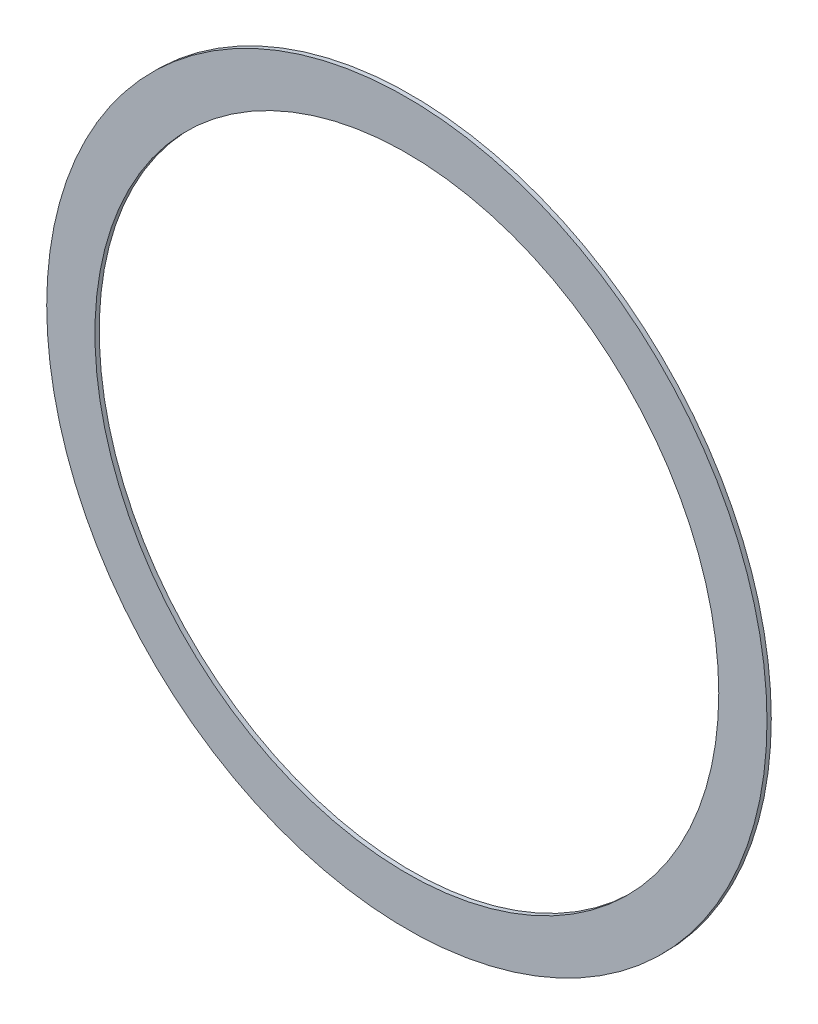
ISO-10303-21;
HEADER;
FILE_DESCRIPTION(('STEP AP214'),'2;1');
FILE_NAME('part.step','',(''),(''),'','','');
FILE_SCHEMA(('AUTOMOTIVE_DESIGN { 1 0 10303 214 1 1 1 1 }'));
ENDSEC;
DATA;
#1=APPLICATION_CONTEXT('core data for automotive mechanical design processes');
#2=APPLICATION_PROTOCOL_DEFINITION('international standard','automotive_design',2000,#1);
#3=PRODUCT_CONTEXT('',#1,'mechanical');
#4=PRODUCT('Part','Part','',(#3));
#5=PRODUCT_RELATED_PRODUCT_CATEGORY('part','',(#4));
#6=PRODUCT_DEFINITION_FORMATION('','',#4);
#7=PRODUCT_DEFINITION_CONTEXT('part definition',#1,'design');
#8=PRODUCT_DEFINITION('design','',#6,#7);
#9=PRODUCT_DEFINITION_SHAPE('','',#8);
#10=(LENGTH_UNIT() NAMED_UNIT(*) SI_UNIT(.MILLI.,.METRE.));
#11=(NAMED_UNIT(*) PLANE_ANGLE_UNIT() SI_UNIT($,.RADIAN.));
#12=(NAMED_UNIT(*) SI_UNIT($,.STERADIAN.) SOLID_ANGLE_UNIT());
#13=UNCERTAINTY_MEASURE_WITH_UNIT(LENGTH_MEASURE(1.E-05),#10,'distance_accuracy_value','');
#14=(GEOMETRIC_REPRESENTATION_CONTEXT(3) GLOBAL_UNCERTAINTY_ASSIGNED_CONTEXT((#13)) GLOBAL_UNIT_ASSIGNED_CONTEXT((#10,
#11,#12)) REPRESENTATION_CONTEXT('',''));
#15=CARTESIAN_POINT('',(0.,0.,0.));
#16=DIRECTION('',(0.,0.,1.));
#17=DIRECTION('',(1.,0.,0.));
#18=AXIS2_PLACEMENT_3D('',#15,#16,#17);
#19=CARTESIAN_POINT('',(0.,0.,3.175));
#20=DIRECTION('',(0.,0.,1.));
#21=DIRECTION('',(1.,0.,0.));
#22=AXIS2_PLACEMENT_3D('',#19,#20,#21);
#23=PLANE('',#22);
#24=CARTESIAN_POINT('',(0.,0.,3.175));
#25=DIRECTION('',(0.,0.,1.));
#26=DIRECTION('',(1.,0.,0.));
#27=AXIS2_PLACEMENT_3D('',#24,#25,#26);
#28=CIRCLE('',#27,266.7);
#29=CARTESIAN_POINT('',(266.7,0.,3.175));
#30=VERTEX_POINT('',#29);
#31=EDGE_CURVE('E10',#30,#30,#28,.T.);
#32=ORIENTED_EDGE('',*,*,#31,.T.);
#33=EDGE_LOOP('',(#32));
#34=FACE_BOUND('',#33,.T.);
#35=CARTESIAN_POINT('',(0.,0.,3.175));
#36=DIRECTION('',(0.,0.,1.));
#37=DIRECTION('',(1.,0.,0.));
#38=AXIS2_PLACEMENT_3D('',#35,#36,#37);
#39=CIRCLE('',#38,230.98125);
#40=CARTESIAN_POINT('',(230.98125,0.,3.175));
#41=VERTEX_POINT('',#40);
#42=EDGE_CURVE('E49',#41,#41,#39,.T.);
#43=ORIENTED_EDGE('',*,*,#42,.F.);
#44=EDGE_LOOP('',(#43));
#45=FACE_BOUND('',#44,.T.);
#46=ADVANCED_FACE('F36',(#34,#45),#23,.T.);
#47=CARTESIAN_POINT('',(0.,0.,0.));
#48=DIRECTION('',(0.,0.,1.));
#49=DIRECTION('',(1.,0.,0.));
#50=AXIS2_PLACEMENT_3D('',#47,#48,#49);
#51=PLANE('',#50);
#52=CARTESIAN_POINT('',(0.,0.,0.));
#53=DIRECTION('',(0.,0.,1.));
#54=DIRECTION('',(1.,0.,0.));
#55=AXIS2_PLACEMENT_3D('',#52,#53,#54);
#56=CIRCLE('',#55,266.7);
#57=CARTESIAN_POINT('',(266.7,0.,0.));
#58=VERTEX_POINT('',#57);
#59=EDGE_CURVE('E40',#58,#58,#56,.T.);
#60=ORIENTED_EDGE('',*,*,#59,.F.);
#61=EDGE_LOOP('',(#60));
#62=FACE_BOUND('',#61,.T.);
#63=CARTESIAN_POINT('',(0.,0.,0.));
#64=DIRECTION('',(0.,0.,1.));
#65=DIRECTION('',(1.,0.,0.));
#66=AXIS2_PLACEMENT_3D('',#63,#64,#65);
#67=CIRCLE('',#66,230.98125);
#68=CARTESIAN_POINT('',(230.98125,0.,0.));
#69=VERTEX_POINT('',#68);
#70=EDGE_CURVE('E51',#69,#69,#67,.T.);
#71=ORIENTED_EDGE('',*,*,#70,.T.);
#72=EDGE_LOOP('',(#71));
#73=FACE_BOUND('',#72,.T.);
#74=ADVANCED_FACE('F63',(#62,#73),#51,.F.);
#75=CARTESIAN_POINT('',(0.,0.,3.175));
#76=DIRECTION('',(0.,0.,-1.));
#77=DIRECTION('',(-1.,0.,0.));
#78=AXIS2_PLACEMENT_3D('',#75,#76,#77);
#79=CYLINDRICAL_SURFACE('',#78,266.7);
#80=ORIENTED_EDGE('',*,*,#31,.F.);
#81=EDGE_LOOP('',(#80));
#82=FACE_BOUND('',#81,.T.);
#83=ORIENTED_EDGE('',*,*,#59,.T.);
#84=EDGE_LOOP('',(#83));
#85=FACE_BOUND('',#84,.T.);
#86=ADVANCED_FACE('F38',(#82,#85),#79,.T.);
#87=CARTESIAN_POINT('',(0.,0.,3.175));
#88=DIRECTION('',(0.,0.,-1.));
#89=DIRECTION('',(-1.,0.,0.));
#90=AXIS2_PLACEMENT_3D('',#87,#88,#89);
#91=CYLINDRICAL_SURFACE('',#90,230.98125);
#92=ORIENTED_EDGE('',*,*,#42,.T.);
#93=EDGE_LOOP('',(#92));
#94=FACE_BOUND('',#93,.T.);
#95=ORIENTED_EDGE('',*,*,#70,.F.);
#96=EDGE_LOOP('',(#95));
#97=FACE_BOUND('',#96,.T.);
#98=ADVANCED_FACE('F59',(#94,#97),#91,.F.);
#99=CLOSED_SHELL('',(#46,#74,#86,#98));
#100=MANIFOLD_SOLID_BREP('B2',#99);
#101=ADVANCED_BREP_SHAPE_REPRESENTATION('',(#18,#100),#14);
#102=SHAPE_DEFINITION_REPRESENTATION(#9,#101);
ENDSEC;
END-ISO-10303-21;
